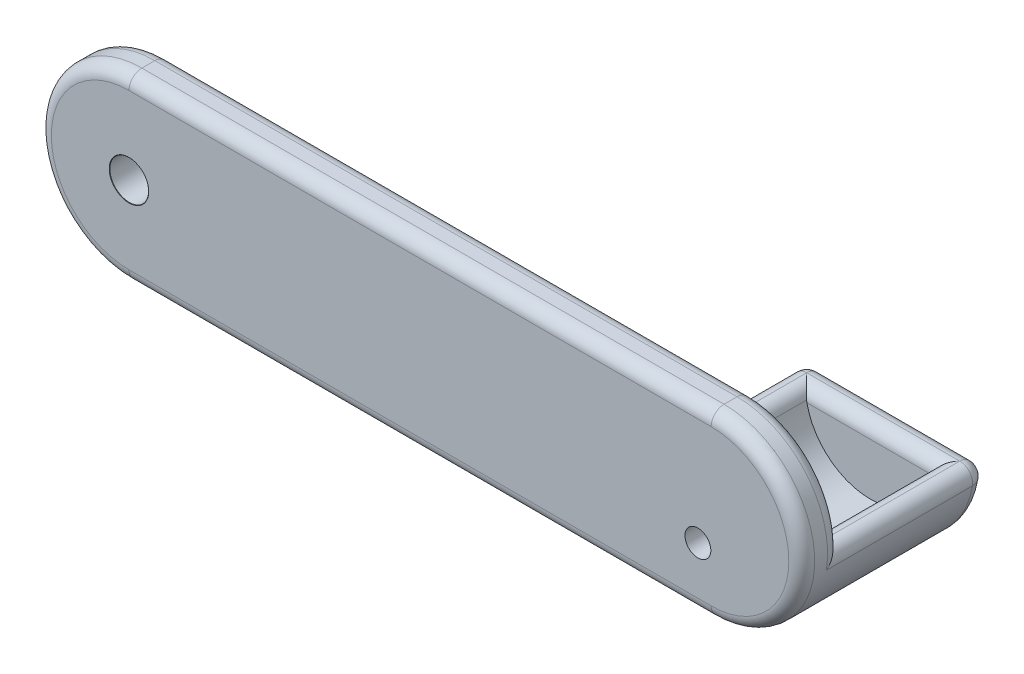
ISO-10303-21;
HEADER;
FILE_DESCRIPTION(('STEP AP214'),'2;1');
FILE_NAME('part.step','',(''),(''),'','','');
FILE_SCHEMA(('AUTOMOTIVE_DESIGN { 1 0 10303 214 1 1 1 1 }'));
ENDSEC;
DATA;
#1=APPLICATION_CONTEXT('core data for automotive mechanical design processes');
#2=APPLICATION_PROTOCOL_DEFINITION('international standard','automotive_design',2000,#1);
#3=PRODUCT_CONTEXT('',#1,'mechanical');
#4=PRODUCT('Part','Part','',(#3));
#5=PRODUCT_RELATED_PRODUCT_CATEGORY('part','',(#4));
#6=PRODUCT_DEFINITION_FORMATION('','',#4);
#7=PRODUCT_DEFINITION_CONTEXT('part definition',#1,'design');
#8=PRODUCT_DEFINITION('design','',#6,#7);
#9=PRODUCT_DEFINITION_SHAPE('','',#8);
#10=(LENGTH_UNIT() NAMED_UNIT(*) SI_UNIT(.MILLI.,.METRE.));
#11=(NAMED_UNIT(*) PLANE_ANGLE_UNIT() SI_UNIT($,.RADIAN.));
#12=(NAMED_UNIT(*) SI_UNIT($,.STERADIAN.) SOLID_ANGLE_UNIT());
#13=UNCERTAINTY_MEASURE_WITH_UNIT(LENGTH_MEASURE(1.E-05),#10,'distance_accuracy_value','');
#14=(GEOMETRIC_REPRESENTATION_CONTEXT(3) GLOBAL_UNCERTAINTY_ASSIGNED_CONTEXT((#13)) GLOBAL_UNIT_ASSIGNED_CONTEXT((#10,
#11,#12)) REPRESENTATION_CONTEXT('',''));
#15=CARTESIAN_POINT('',(0.,0.,0.));
#16=DIRECTION('',(0.,0.,1.));
#17=DIRECTION('',(1.,0.,0.));
#18=AXIS2_PLACEMENT_3D('',#15,#16,#17);
#19=CARTESIAN_POINT('',(0.,0.,3.));
#20=DIRECTION('',(0.,0.,-1.));
#21=DIRECTION('',(-1.,0.,0.));
#22=AXIS2_PLACEMENT_3D('',#19,#20,#21);
#23=CYLINDRICAL_SURFACE('',#22,7.);
#24=DIRECTION('',(0.,0.,-1.));
#25=VECTOR('',#24,1.);
#26=CARTESIAN_POINT('',(0.,-7.,3.));
#27=LINE('',#26,#25);
#28=CARTESIAN_POINT('',(0.,-7.,2.));
#29=VERTEX_POINT('',#28);
#30=CARTESIAN_POINT('',(0.,-7.,1.));
#31=VERTEX_POINT('',#30);
#32=EDGE_CURVE('E501',#29,#31,#27,.T.);
#33=ORIENTED_EDGE('',*,*,#32,.F.);
#34=CARTESIAN_POINT('',(0.,0.,2.));
#35=DIRECTION('',(0.,0.,1.));
#36=DIRECTION('',(1.,0.,0.));
#37=AXIS2_PLACEMENT_3D('',#34,#35,#36);
#38=CIRCLE('',#37,7.);
#39=CARTESIAN_POINT('',(0.,7.,2.));
#40=VERTEX_POINT('',#39);
#41=EDGE_CURVE('E427',#29,#40,#38,.F.);
#42=ORIENTED_EDGE('',*,*,#41,.T.);
#43=DIRECTION('',(0.,0.,-1.));
#44=VECTOR('',#43,1.);
#45=CARTESIAN_POINT('',(0.,7.,3.));
#46=LINE('',#45,#44);
#47=CARTESIAN_POINT('',(0.,7.,1.));
#48=VERTEX_POINT('',#47);
#49=EDGE_CURVE('E533',#40,#48,#46,.T.);
#50=ORIENTED_EDGE('',*,*,#49,.T.);
#51=CARTESIAN_POINT('',(0.,0.,1.));
#52=DIRECTION('',(0.,0.,1.));
#53=DIRECTION('',(1.,0.,0.));
#54=AXIS2_PLACEMENT_3D('',#51,#52,#53);
#55=CIRCLE('',#54,7.);
#56=EDGE_CURVE('E529',#48,#31,#55,.T.);
#57=ORIENTED_EDGE('',*,*,#56,.T.);
#58=EDGE_LOOP('',(#33,#42,#50,#57));
#59=FACE_BOUND('',#58,.T.);
#60=ADVANCED_FACE('F39',(#59),#23,.T.);
#61=CARTESIAN_POINT('',(0.,-7.,3.));
#62=DIRECTION('',(0.,1.,0.));
#63=DIRECTION('',(0.,0.,1.));
#64=AXIS2_PLACEMENT_3D('',#61,#62,#63);
#65=PLANE('',#64);
#66=DIRECTION('',(0.,0.,-1.));
#67=VECTOR('',#66,1.);
#68=CARTESIAN_POINT('',(45.,-7.,3.));
#69=LINE('',#68,#67);
#70=CARTESIAN_POINT('',(45.,-7.,2.));
#71=VERTEX_POINT('',#70);
#72=CARTESIAN_POINT('',(45.,-7.,1.));
#73=VERTEX_POINT('',#72);
#74=EDGE_CURVE('E508',#71,#73,#69,.T.);
#75=ORIENTED_EDGE('',*,*,#74,.F.);
#76=DIRECTION('',(1.,0.,0.));
#77=VECTOR('',#76,1.);
#78=CARTESIAN_POINT('',(0.,-7.,2.));
#79=LINE('',#78,#77);
#80=EDGE_CURVE('E526',#71,#29,#79,.F.);
#81=ORIENTED_EDGE('',*,*,#80,.T.);
#82=ORIENTED_EDGE('',*,*,#32,.T.);
#83=DIRECTION('',(1.,0.,0.));
#84=VECTOR('',#83,1.);
#85=CARTESIAN_POINT('',(0.,-7.,1.));
#86=LINE('',#85,#84);
#87=EDGE_CURVE('E522',#31,#73,#86,.T.);
#88=ORIENTED_EDGE('',*,*,#87,.T.);
#89=EDGE_LOOP('',(#75,#81,#82,#88));
#90=FACE_BOUND('',#89,.T.);
#91=ADVANCED_FACE('F372',(#90),#65,.F.);
#92=CARTESIAN_POINT('',(45.,0.,3.));
#93=DIRECTION('',(0.,0.,-1.));
#94=DIRECTION('',(-1.,0.,0.));
#95=AXIS2_PLACEMENT_3D('',#92,#93,#94);
#96=CYLINDRICAL_SURFACE('',#95,7.);
#97=DIRECTION('',(0.,0.,-1.));
#98=VECTOR('',#97,1.);
#99=CARTESIAN_POINT('',(45.,7.,3.));
#100=LINE('',#99,#98);
#101=CARTESIAN_POINT('',(45.,7.,2.));
#102=VERTEX_POINT('',#101);
#103=CARTESIAN_POINT('',(45.,7.,1.));
#104=VERTEX_POINT('',#103);
#105=EDGE_CURVE('E537',#102,#104,#100,.T.);
#106=ORIENTED_EDGE('',*,*,#105,.F.);
#107=CARTESIAN_POINT('',(45.,0.,2.));
#108=DIRECTION('',(0.,0.,1.));
#109=DIRECTION('',(1.,0.,0.));
#110=AXIS2_PLACEMENT_3D('',#107,#108,#109);
#111=CIRCLE('',#110,7.);
#112=EDGE_CURVE('E469',#102,#71,#111,.F.);
#113=ORIENTED_EDGE('',*,*,#112,.T.);
#114=ORIENTED_EDGE('',*,*,#74,.T.);
#115=CARTESIAN_POINT('',(41.394448724536,-6.,0.));
#116=CARTESIAN_POINT('',(41.4450582268438,-6.03041382753642,7.08769697743042E-06));
#117=CARTESIAN_POINT('',(41.496037033125,-6.06017529147223,0.00138651836895668));
#118=CARTESIAN_POINT('',(41.5986147008607,-6.11833715170324,0.00659608572355327));
#119=CARTESIAN_POINT('',(41.6502132829137,-6.14673813449379,0.0104251559731933));
#120=CARTESIAN_POINT('',(41.8055802187509,-6.22972265473013,0.0251248258331152));
#121=CARTESIAN_POINT('',(41.9101619313692,-6.28223313790196,0.039210738007179));
#122=CARTESIAN_POINT('',(42.1203271140369,-6.38129477477753,0.074064378667023));
#123=CARTESIAN_POINT('',(42.225903170781,-6.42787385145519,0.0947990492975347));
#124=CARTESIAN_POINT('',(42.4382615831537,-6.51542025173984,0.141626106099852));
#125=CARTESIAN_POINT('',(42.5450448307451,-6.55638308630496,0.167722736920281));
#126=CARTESIAN_POINT('',(42.8433780021751,-6.66259073906168,0.246247130070275));
#127=CARTESIAN_POINT('',(43.035901662057,-6.72176788527623,0.303304781123062));
#128=CARTESIAN_POINT('',(43.4225710412745,-6.82288362390491,0.42624186896687));
#129=CARTESIAN_POINT('',(43.6167177322626,-6.86481100323072,0.492127007236582));
#130=CARTESIAN_POINT('',(44.2010708063447,-6.96548017899727,0.698011486307675));
#131=CARTESIAN_POINT('',(44.5931882114788,-6.99910832303838,0.846239297791334));
#132=CARTESIAN_POINT('',(44.9895651844608,-6.99999416059354,0.996056036911788));
#133=CARTESIAN_POINT('',(44.9947826816277,-6.99999999336149,0.998028066018506));
#134=CARTESIAN_POINT('',(45.,-7.,1.));
#135=B_SPLINE_CURVE_WITH_KNOTS('',3,(#115,#116,#117,#118,#119,#120,#121,#122,#123,#124,#125,
#126,#127,#128,#129,#130,#131,#132,#133,#134),.UNSPECIFIED.,.F.,.F.,(4,2,2,2,2,2,2,2,2,4),(0.,
0.177083512310358,0.354089984998802,0.707258810861283,1.05869820978894,1.41041689543041,
2.03723640077628,2.66446272434067,3.91892182880158,3.93565503848337),.UNSPECIFIED.);
#136=CARTESIAN_POINT('',(41.394448724536,-6.,0.));
#137=VERTEX_POINT('',#136);
#138=EDGE_CURVE('E375',#73,#137,#135,.F.);
#139=ORIENTED_EDGE('',*,*,#138,.T.);
#140=CARTESIAN_POINT('',(45.,0.,0.));
#141=DIRECTION('',(0.,0.,1.));
#142=DIRECTION('',(1.,0.,0.));
#143=AXIS2_PLACEMENT_3D('',#140,#141,#142);
#144=CIRCLE('',#143,7.);
#145=CARTESIAN_POINT('',(38.0979069197171,-1.16666666666667,0.));
#146=VERTEX_POINT('',#145);
#147=EDGE_CURVE('E500',#146,#137,#144,.T.);
#148=ORIENTED_EDGE('',*,*,#147,.F.);
#149=DIRECTION('',(0.,0.,-1.));
#150=VECTOR('',#149,1.);
#151=CARTESIAN_POINT('',(38.0979069197171,-1.16666666666667,3.));
#152=LINE('',#151,#150);
#153=CARTESIAN_POINT('',(38.0979069197171,-1.16666666666667,-10.3));
#154=VERTEX_POINT('',#153);
#155=EDGE_CURVE('E466',#146,#154,#152,.T.);
#156=ORIENTED_EDGE('',*,*,#155,.T.);
#157=CARTESIAN_POINT('',(45.,0.,-10.3));
#158=DIRECTION('',(0.,0.,-1.));
#159=DIRECTION('',(-1.,0.,0.));
#160=AXIS2_PLACEMENT_3D('',#157,#158,#159);
#161=CIRCLE('',#160,7.);
#162=CARTESIAN_POINT('',(51.9020930802829,-1.16666666666667,-10.3));
#163=VERTEX_POINT('',#162);
#164=EDGE_CURVE('E460',#154,#163,#161,.F.);
#165=ORIENTED_EDGE('',*,*,#164,.T.);
#166=DIRECTION('',(0.,0.,-1.));
#167=VECTOR('',#166,1.);
#168=CARTESIAN_POINT('',(51.9020930802829,-1.16666666666667,3.));
#169=LINE('',#168,#167);
#170=CARTESIAN_POINT('',(51.9020930802829,-1.16666666666667,1.));
#171=VERTEX_POINT('',#170);
#172=EDGE_CURVE('E457',#163,#171,#169,.F.);
#173=ORIENTED_EDGE('',*,*,#172,.T.);
#174=CARTESIAN_POINT('',(45.,0.,1.));
#175=DIRECTION('',(0.,0.,1.));
#176=DIRECTION('',(1.,0.,0.));
#177=AXIS2_PLACEMENT_3D('',#174,#175,#176);
#178=CIRCLE('',#177,7.);
#179=EDGE_CURVE('E463',#171,#104,#178,.T.);
#180=ORIENTED_EDGE('',*,*,#179,.T.);
#181=EDGE_LOOP('',(#106,#113,#114,#139,#148,#156,#165,#173,#180));
#182=FACE_BOUND('',#181,.T.);
#183=ADVANCED_FACE('F367',(#182),#96,.T.);
#184=CARTESIAN_POINT('',(0.,7.,3.));
#185=DIRECTION('',(0.,-1.,0.));
#186=DIRECTION('',(0.,0.,-1.));
#187=AXIS2_PLACEMENT_3D('',#184,#185,#186);
#188=PLANE('',#187);
#189=ORIENTED_EDGE('',*,*,#49,.F.);
#190=DIRECTION('',(-1.,0.,0.));
#191=VECTOR('',#190,1.);
#192=CARTESIAN_POINT('',(45.,7.,2.));
#193=LINE('',#192,#191);
#194=EDGE_CURVE('E434',#40,#102,#193,.F.);
#195=ORIENTED_EDGE('',*,*,#194,.T.);
#196=ORIENTED_EDGE('',*,*,#105,.T.);
#197=DIRECTION('',(-1.,0.,0.));
#198=VECTOR('',#197,1.);
#199=CARTESIAN_POINT('',(0.,7.,1.));
#200=LINE('',#199,#198);
#201=EDGE_CURVE('E440',#104,#48,#200,.T.);
#202=ORIENTED_EDGE('',*,*,#201,.T.);
#203=EDGE_LOOP('',(#189,#195,#196,#202));
#204=FACE_BOUND('',#203,.T.);
#205=ADVANCED_FACE('F360',(#204),#188,.F.);
#206=CARTESIAN_POINT('',(0.,0.,3.));
#207=DIRECTION('',(0.,0.,1.));
#208=DIRECTION('',(1.,0.,0.));
#209=AXIS2_PLACEMENT_3D('',#206,#207,#208);
#210=PLANE('',#209);
#211=CARTESIAN_POINT('',(43.9748477834291,-2.3,3.));
#212=DIRECTION('',(0.,0.,1.));
#213=DIRECTION('',(1.,0.,0.));
#214=AXIS2_PLACEMENT_3D('',#211,#212,#213);
#215=CIRCLE('',#214,0.999999999999994);
#216=CARTESIAN_POINT('',(44.9748477834291,-2.3,3.));
#217=VERTEX_POINT('',#216);
#218=EDGE_CURVE('E272',#217,#217,#215,.T.);
#219=ORIENTED_EDGE('',*,*,#218,.F.);
#220=EDGE_LOOP('',(#219));
#221=FACE_BOUND('',#220,.T.);
#222=CARTESIAN_POINT('',(0.,0.,3.));
#223=DIRECTION('',(0.,0.,1.));
#224=DIRECTION('',(1.,0.,0.));
#225=AXIS2_PLACEMENT_3D('',#222,#223,#224);
#226=CIRCLE('',#225,6.);
#227=CARTESIAN_POINT('',(0.,6.,3.));
#228=VERTEX_POINT('',#227);
#229=CARTESIAN_POINT('',(0.,-6.,3.));
#230=VERTEX_POINT('',#229);
#231=EDGE_CURVE('E429',#228,#230,#226,.T.);
#232=ORIENTED_EDGE('',*,*,#231,.T.);
#233=DIRECTION('',(1.,0.,0.));
#234=VECTOR('',#233,1.);
#235=CARTESIAN_POINT('',(45.,-6.,3.));
#236=LINE('',#235,#234);
#237=CARTESIAN_POINT('',(45.,-6.,3.));
#238=VERTEX_POINT('',#237);
#239=EDGE_CURVE('E518',#230,#238,#236,.T.);
#240=ORIENTED_EDGE('',*,*,#239,.T.);
#241=CARTESIAN_POINT('',(45.,0.,3.));
#242=DIRECTION('',(0.,0.,1.));
#243=DIRECTION('',(1.,0.,0.));
#244=AXIS2_PLACEMENT_3D('',#241,#242,#243);
#245=CIRCLE('',#244,6.);
#246=CARTESIAN_POINT('',(45.,6.,3.));
#247=VERTEX_POINT('',#246);
#248=EDGE_CURVE('E505',#238,#247,#245,.T.);
#249=ORIENTED_EDGE('',*,*,#248,.T.);
#250=DIRECTION('',(-1.,0.,0.));
#251=VECTOR('',#250,1.);
#252=CARTESIAN_POINT('',(0.,6.,3.));
#253=LINE('',#252,#251);
#254=EDGE_CURVE('E433',#247,#228,#253,.T.);
#255=ORIENTED_EDGE('',*,*,#254,.T.);
#256=EDGE_LOOP('',(#232,#240,#249,#255));
#257=FACE_BOUND('',#256,.T.);
#258=CARTESIAN_POINT('',(0.,0.,3.));
#259=DIRECTION('',(0.,0.,1.));
#260=DIRECTION('',(1.,0.,0.));
#261=AXIS2_PLACEMENT_3D('',#258,#259,#260);
#262=CIRCLE('',#261,1.525);
#263=CARTESIAN_POINT('',(1.525,0.,3.));
#264=VERTEX_POINT('',#263);
#265=EDGE_CURVE('E556',#264,#264,#262,.T.);
#266=ORIENTED_EDGE('',*,*,#265,.F.);
#267=EDGE_LOOP('',(#266));
#268=FACE_BOUND('',#267,.T.);
#269=ADVANCED_FACE('F357',(#221,#257,#268),#210,.T.);
#270=CARTESIAN_POINT('',(0.,0.,0.));
#271=DIRECTION('',(0.,0.,1.));
#272=DIRECTION('',(1.,0.,0.));
#273=AXIS2_PLACEMENT_3D('',#270,#271,#272);
#274=PLANE('',#273);
#275=CARTESIAN_POINT('',(0.,0.,0.));
#276=DIRECTION('',(0.,0.,1.));
#277=DIRECTION('',(1.,0.,0.));
#278=AXIS2_PLACEMENT_3D('',#275,#276,#277);
#279=CIRCLE('',#278,1.5);
#280=CARTESIAN_POINT('',(1.5,0.,0.));
#281=VERTEX_POINT('',#280);
#282=EDGE_CURVE('E538',#281,#281,#279,.T.);
#283=ORIENTED_EDGE('',*,*,#282,.T.);
#284=EDGE_LOOP('',(#283));
#285=FACE_BOUND('',#284,.T.);
#286=ORIENTED_EDGE('',*,*,#147,.T.);
#287=DIRECTION('',(1.,0.,0.));
#288=VECTOR('',#287,1.);
#289=CARTESIAN_POINT('',(0.,-6.,0.));
#290=LINE('',#289,#288);
#291=CARTESIAN_POINT('',(0.,-6.,0.));
#292=VERTEX_POINT('',#291);
#293=EDGE_CURVE('E454',#137,#292,#290,.F.);
#294=ORIENTED_EDGE('',*,*,#293,.T.);
#295=CARTESIAN_POINT('',(0.,0.,0.));
#296=DIRECTION('',(0.,0.,1.));
#297=DIRECTION('',(1.,0.,0.));
#298=AXIS2_PLACEMENT_3D('',#295,#296,#297);
#299=CIRCLE('',#298,6.);
#300=CARTESIAN_POINT('',(0.,6.,0.));
#301=VERTEX_POINT('',#300);
#302=EDGE_CURVE('E451',#292,#301,#299,.F.);
#303=ORIENTED_EDGE('',*,*,#302,.T.);
#304=DIRECTION('',(-1.,0.,0.));
#305=VECTOR('',#304,1.);
#306=CARTESIAN_POINT('',(0.,6.,0.));
#307=LINE('',#306,#305);
#308=CARTESIAN_POINT('',(45.,6.,0.));
#309=VERTEX_POINT('',#308);
#310=EDGE_CURVE('E444',#301,#309,#307,.F.);
#311=ORIENTED_EDGE('',*,*,#310,.T.);
#312=CARTESIAN_POINT('',(45.,0.,0.));
#313=DIRECTION('',(0.,0.,1.));
#314=DIRECTION('',(1.,0.,0.));
#315=AXIS2_PLACEMENT_3D('',#312,#313,#314);
#316=CIRCLE('',#315,6.);
#317=CARTESIAN_POINT('',(50.9999989630996,-0.00352743578701569,0.));
#318=VERTEX_POINT('',#317);
#319=EDGE_CURVE('E185',#309,#318,#316,.F.);
#320=ORIENTED_EDGE('',*,*,#319,.T.);
#321=CARTESIAN_POINT('',(50.9160797830996,-0.999999999999999,0.));
#322=DIRECTION('',(0.,0.,1.));
#323=DIRECTION('',(1.,0.,0.));
#324=AXIS2_PLACEMENT_3D('',#321,#322,#323);
#325=CIRCLE('',#324,1.);
#326=CARTESIAN_POINT('',(50.9160797830996,0.,0.));
#327=VERTEX_POINT('',#326);
#328=EDGE_CURVE('E11',#318,#327,#325,.T.);
#329=ORIENTED_EDGE('',*,*,#328,.T.);
#330=CARTESIAN_POINT('',(50.9160797830996,-0.999999999999999,0.));
#331=DIRECTION('',(0.,0.,1.));
#332=DIRECTION('',(1.,0.,0.));
#333=AXIS2_PLACEMENT_3D('',#330,#331,#332);
#334=CIRCLE('',#333,1.);
#335=CARTESIAN_POINT('',(49.9300664859163,-0.833333333333333,0.));
#336=VERTEX_POINT('',#335);
#337=EDGE_CURVE('E183',#327,#336,#334,.T.);
#338=ORIENTED_EDGE('',*,*,#337,.T.);
#339=CARTESIAN_POINT('',(45.,0.,0.));
#340=DIRECTION('',(0.,0.,1.));
#341=DIRECTION('',(1.,0.,0.));
#342=AXIS2_PLACEMENT_3D('',#339,#340,#341);
#343=CIRCLE('',#342,5.);
#344=CARTESIAN_POINT('',(50.,0.,0.));
#345=VERTEX_POINT('',#344);
#346=EDGE_CURVE('E59',#345,#336,#343,.F.);
#347=ORIENTED_EDGE('',*,*,#346,.F.);
#348=DIRECTION('',(-1.,0.,0.));
#349=VECTOR('',#348,1.);
#350=CARTESIAN_POINT('',(0.,0.,0.));
#351=LINE('',#350,#349);
#352=CARTESIAN_POINT('',(40.,0.,0.));
#353=VERTEX_POINT('',#352);
#354=EDGE_CURVE('E498',#345,#353,#351,.T.);
#355=ORIENTED_EDGE('',*,*,#354,.T.);
#356=CARTESIAN_POINT('',(45.,0.,0.));
#357=DIRECTION('',(0.,0.,1.));
#358=DIRECTION('',(1.,0.,0.));
#359=AXIS2_PLACEMENT_3D('',#356,#357,#358);
#360=CIRCLE('',#359,5.);
#361=CARTESIAN_POINT('',(40.0699335140837,-0.833333333333333,0.));
#362=VERTEX_POINT('',#361);
#363=EDGE_CURVE('E482',#362,#353,#360,.F.);
#364=ORIENTED_EDGE('',*,*,#363,.F.);
#365=CARTESIAN_POINT('',(39.0839202169004,-0.999999999999999,0.));
#366=DIRECTION('',(0.,0.,1.));
#367=DIRECTION('',(1.,0.,0.));
#368=AXIS2_PLACEMENT_3D('',#365,#366,#367);
#369=CIRCLE('',#368,1.);
#370=CARTESIAN_POINT('',(39.0839202169004,0.,0.));
#371=VERTEX_POINT('',#370);
#372=EDGE_CURVE('E199',#362,#371,#369,.T.);
#373=ORIENTED_EDGE('',*,*,#372,.T.);
#374=CARTESIAN_POINT('',(39.0839202169004,-0.999999999999999,0.));
#375=DIRECTION('',(0.,0.,1.));
#376=DIRECTION('',(1.,0.,0.));
#377=AXIS2_PLACEMENT_3D('',#374,#375,#376);
#378=CIRCLE('',#377,1.);
#379=EDGE_CURVE('E50',#371,#146,#378,.T.);
#380=ORIENTED_EDGE('',*,*,#379,.T.);
#381=EDGE_LOOP('',(#286,#294,#303,#311,#320,#329,#338,#347,#355,#364,#373,#380));
#382=FACE_BOUND('',#381,.T.);
#383=ADVANCED_FACE('F182',(#285,#382),#274,.F.);
#384=CARTESIAN_POINT('',(0.,0.,3.));
#385=DIRECTION('',(0.,0.,1.));
#386=DIRECTION('',(1.,0.,0.));
#387=AXIS2_PLACEMENT_3D('',#384,#385,#386);
#388=CYLINDRICAL_SURFACE('',#387,1.5);
#389=ORIENTED_EDGE('',*,*,#282,.F.);
#390=EDGE_LOOP('',(#389));
#391=FACE_BOUND('',#390,.T.);
#392=CARTESIAN_POINT('',(0.,0.,2.97902250922057));
#393=DIRECTION('',(0.,0.,1.));
#394=DIRECTION('',(1.,0.,0.));
#395=AXIS2_PLACEMENT_3D('',#392,#393,#394);
#396=CIRCLE('',#395,1.5);
#397=CARTESIAN_POINT('',(1.5,0.,2.97902250922057));
#398=VERTEX_POINT('',#397);
#399=EDGE_CURVE('E544',#398,#398,#396,.T.);
#400=ORIENTED_EDGE('',*,*,#399,.T.);
#401=EDGE_LOOP('',(#400));
#402=FACE_BOUND('',#401,.T.);
#403=ADVANCED_FACE('F352',(#391,#402),#388,.F.);
#404=CARTESIAN_POINT('',(0.,0.,3.));
#405=DIRECTION('',(0.,0.,1.));
#406=DIRECTION('',(1.,0.,0.));
#407=AXIS2_PLACEMENT_3D('',#404,#405,#406);
#408=CONICAL_SURFACE('',#407,1.525,0.872664625997208);
#409=ORIENTED_EDGE('',*,*,#399,.F.);
#410=EDGE_LOOP('',(#409));
#411=FACE_BOUND('',#410,.T.);
#412=ORIENTED_EDGE('',*,*,#265,.T.);
#413=EDGE_LOOP('',(#412));
#414=FACE_BOUND('',#413,.T.);
#415=ADVANCED_FACE('F348',(#411,#414),#408,.F.);
#416=CARTESIAN_POINT('',(45.,0.,-11.3));
#417=DIRECTION('',(0.,0.,-1.));
#418=DIRECTION('',(-1.,0.,0.));
#419=AXIS2_PLACEMENT_3D('',#416,#417,#418);
#420=PLANE('',#419);
#421=DIRECTION('',(-1.,0.,0.));
#422=VECTOR('',#421,1.);
#423=CARTESIAN_POINT('',(45.,-1.,-11.3));
#424=LINE('',#423,#422);
#425=CARTESIAN_POINT('',(39.0839202169004,-1.,-11.3));
#426=VERTEX_POINT('',#425);
#427=CARTESIAN_POINT('',(50.9160797830996,-1.,-11.3));
#428=VERTEX_POINT('',#427);
#429=EDGE_CURVE('E472',#426,#428,#424,.F.);
#430=ORIENTED_EDGE('',*,*,#429,.T.);
#431=CARTESIAN_POINT('',(45.,0.,-11.3));
#432=DIRECTION('',(0.,0.,-1.));
#433=DIRECTION('',(-1.,0.,0.));
#434=AXIS2_PLACEMENT_3D('',#431,#432,#433);
#435=CIRCLE('',#434,6.);
#436=EDGE_CURVE('E475',#428,#426,#435,.T.);
#437=ORIENTED_EDGE('',*,*,#436,.T.);
#438=EDGE_LOOP('',(#430,#437));
#439=FACE_BOUND('',#438,.T.);
#440=ADVANCED_FACE('F345',(#439),#420,.T.);
#441=CARTESIAN_POINT('',(38.,0.,-11.3));
#442=DIRECTION('',(0.,1.,0.));
#443=DIRECTION('',(0.,0.,1.));
#444=AXIS2_PLACEMENT_3D('',#441,#442,#443);
#445=PLANE('',#444);
#446=DIRECTION('',(0.,0.,-1.));
#447=VECTOR('',#446,1.);
#448=CARTESIAN_POINT('',(50.,0.,-9.3));
#449=LINE('',#448,#447);
#450=CARTESIAN_POINT('',(50.,0.,1.));
#451=VERTEX_POINT('',#450);
#452=EDGE_CURVE('E86',#345,#451,#449,.F.);
#453=ORIENTED_EDGE('',*,*,#452,.T.);
#454=DIRECTION('',(-1.,0.,0.));
#455=VECTOR('',#454,1.);
#456=CARTESIAN_POINT('',(0.,0.,1.));
#457=LINE('',#456,#455);
#458=CARTESIAN_POINT('',(40.,0.,1.));
#459=VERTEX_POINT('',#458);
#460=EDGE_CURVE('E559',#451,#459,#457,.T.);
#461=ORIENTED_EDGE('',*,*,#460,.T.);
#462=DIRECTION('',(0.,0.,-1.));
#463=VECTOR('',#462,1.);
#464=CARTESIAN_POINT('',(40.,0.,-9.3));
#465=LINE('',#464,#463);
#466=EDGE_CURVE('E495',#353,#459,#465,.F.);
#467=ORIENTED_EDGE('',*,*,#466,.F.);
#468=ORIENTED_EDGE('',*,*,#354,.F.);
#469=EDGE_LOOP('',(#453,#461,#467,#468));
#470=FACE_BOUND('',#469,.T.);
#471=ADVANCED_FACE('F333',(#470),#445,.F.);
#472=CARTESIAN_POINT('',(45.,0.,3.));
#473=DIRECTION('',(0.,0.,-1.));
#474=DIRECTION('',(-1.,0.,0.));
#475=AXIS2_PLACEMENT_3D('',#472,#473,#474);
#476=CYLINDRICAL_SURFACE('',#475,5.);
#477=ORIENTED_EDGE('',*,*,#452,.F.);
#478=ORIENTED_EDGE('',*,*,#346,.T.);
#479=DIRECTION('',(0.,0.,-1.));
#480=VECTOR('',#479,1.);
#481=CARTESIAN_POINT('',(49.9300664859163,-0.833333333333333,3.));
#482=LINE('',#481,#480);
#483=CARTESIAN_POINT('',(49.9300664859163,-0.833333333333333,-9.31398670281663));
#484=VERTEX_POINT('',#483);
#485=EDGE_CURVE('E197',#336,#484,#482,.T.);
#486=ORIENTED_EDGE('',*,*,#485,.T.);
#487=CARTESIAN_POINT('',(49.9300664859163,-0.833333333333333,-9.31398670281663));
#488=CARTESIAN_POINT('',(49.9253916142134,-0.861009601778235,-9.30932069546009));
#489=CARTESIAN_POINT('',(49.9204635949994,-0.888736624889429,-9.30582213321377));
#490=CARTESIAN_POINT('',(49.9101012615495,-0.944292180444995,-9.3011598989415));
#491=CARTESIAN_POINT('',(49.9046669473134,-0.97212071288937,-9.29999622691561));
#492=CARTESIAN_POINT('',(49.8989794855664,-1.00000000000004,-9.29999999999999));
#493=B_SPLINE_CURVE_WITH_KNOTS('',3,(#487,#488,#489,#490,#491,#492),.UNSPECIFIED.,.F.,.F.,(4,2,
4),(0.,0.0851341182837871,0.170268236569399),.UNSPECIFIED.);
#494=CARTESIAN_POINT('',(49.8989794855664,-1.,-9.3));
#495=VERTEX_POINT('',#494);
#496=EDGE_CURVE('E200',#484,#495,#493,.T.);
#497=ORIENTED_EDGE('',*,*,#496,.T.);
#498=CARTESIAN_POINT('',(45.,0.,-9.3));
#499=DIRECTION('',(0.,0.,-1.));
#500=DIRECTION('',(-1.,0.,0.));
#501=AXIS2_PLACEMENT_3D('',#498,#499,#500);
#502=CIRCLE('',#501,5.);
#503=CARTESIAN_POINT('',(40.1010205144336,-1.,-9.3));
#504=VERTEX_POINT('',#503);
#505=EDGE_CURVE('E266',#504,#495,#502,.F.);
#506=ORIENTED_EDGE('',*,*,#505,.F.);
#507=CARTESIAN_POINT('',(40.1010205144336,-1.,-9.3));
#508=CARTESIAN_POINT('',(40.0953330526866,-0.972120712889341,-9.29999622691564));
#509=CARTESIAN_POINT('',(40.0898987384505,-0.944292180444974,-9.30115989894153));
#510=CARTESIAN_POINT('',(40.0795364050006,-0.888736624889421,-9.30582213321374));
#511=CARTESIAN_POINT('',(40.0746083857866,-0.861009601778232,-9.30932069546002));
#512=CARTESIAN_POINT('',(40.0699335140837,-0.833333333333332,-9.31398670281649));
#513=B_SPLINE_CURVE_WITH_KNOTS('',3,(#507,#508,#509,#510,#511,#512),.UNSPECIFIED.,.F.,.F.,(4,2,
4),(0.,0.0851341182855874,0.170268236569343),.UNSPECIFIED.);
#514=CARTESIAN_POINT('',(40.0699335140837,-0.833333333333333,-9.31398670281663));
#515=VERTEX_POINT('',#514);
#516=EDGE_CURVE('E313',#504,#515,#513,.T.);
#517=ORIENTED_EDGE('',*,*,#516,.T.);
#518=DIRECTION('',(0.,0.,-1.));
#519=VECTOR('',#518,1.);
#520=CARTESIAN_POINT('',(40.0699335140837,-0.833333333333333,3.));
#521=LINE('',#520,#519);
#522=EDGE_CURVE('E485',#515,#362,#521,.F.);
#523=ORIENTED_EDGE('',*,*,#522,.T.);
#524=ORIENTED_EDGE('',*,*,#363,.T.);
#525=ORIENTED_EDGE('',*,*,#466,.T.);
#526=CARTESIAN_POINT('',(45.,0.,1.));
#527=DIRECTION('',(0.,0.,1.));
#528=DIRECTION('',(1.,0.,0.));
#529=AXIS2_PLACEMENT_3D('',#526,#527,#528);
#530=CIRCLE('',#529,5.);
#531=EDGE_CURVE('E493',#459,#451,#530,.T.);
#532=ORIENTED_EDGE('',*,*,#531,.T.);
#533=EDGE_LOOP('',(#477,#478,#486,#497,#506,#517,#523,#524,#525,#532));
#534=FACE_BOUND('',#533,.T.);
#535=ADVANCED_FACE('F327',(#534),#476,.F.);
#536=CARTESIAN_POINT('',(0.,0.,1.));
#537=DIRECTION('',(0.,0.,1.));
#538=DIRECTION('',(1.,0.,0.));
#539=AXIS2_PLACEMENT_3D('',#536,#537,#538);
#540=PLANE('',#539);
#541=CARTESIAN_POINT('',(43.9748477834291,-2.3,0.999999999999998));
#542=DIRECTION('',(0.,0.,-1.));
#543=DIRECTION('',(-1.,0.,0.));
#544=AXIS2_PLACEMENT_3D('',#541,#542,#543);
#545=CIRCLE('',#544,1.025);
#546=CARTESIAN_POINT('',(42.9498477834291,-2.3,0.999999999999998));
#547=VERTEX_POINT('',#546);
#548=EDGE_CURVE('E580',#547,#547,#545,.T.);
#549=ORIENTED_EDGE('',*,*,#548,.F.);
#550=EDGE_LOOP('',(#549));
#551=FACE_BOUND('',#550,.T.);
#552=ORIENTED_EDGE('',*,*,#460,.F.);
#553=ORIENTED_EDGE('',*,*,#531,.F.);
#554=EDGE_LOOP('',(#552,#553));
#555=FACE_BOUND('',#554,.T.);
#556=ADVANCED_FACE('F332',(#551,#555),#540,.F.);
#557=CARTESIAN_POINT('',(45.,0.,-9.3));
#558=DIRECTION('',(0.,0.,-1.));
#559=DIRECTION('',(-1.,0.,0.));
#560=AXIS2_PLACEMENT_3D('',#557,#558,#559);
#561=PLANE('',#560);
#562=ORIENTED_EDGE('',*,*,#505,.T.);
#563=DIRECTION('',(-1.,0.,0.));
#564=VECTOR('',#563,1.);
#565=CARTESIAN_POINT('',(40.,-1.,-9.3));
#566=LINE('',#565,#564);
#567=EDGE_CURVE('E479',#495,#504,#566,.T.);
#568=ORIENTED_EDGE('',*,*,#567,.T.);
#569=EDGE_LOOP('',(#562,#568));
#570=FACE_BOUND('',#569,.T.);
#571=ADVANCED_FACE('F339',(#570),#561,.F.);
#572=CARTESIAN_POINT('',(0.,6.,2.));
#573=DIRECTION('',(1.,0.,0.));
#574=DIRECTION('',(0.,0.,-1.));
#575=AXIS2_PLACEMENT_3D('',#572,#573,#574);
#576=CYLINDRICAL_SURFACE('',#575,1.);
#577=CARTESIAN_POINT('',(45.,6.,2.));
#578=DIRECTION('',(1.,0.,0.));
#579=DIRECTION('',(0.,0.,-1.));
#580=AXIS2_PLACEMENT_3D('',#577,#578,#579);
#581=CIRCLE('',#580,1.);
#582=EDGE_CURVE('E255',#102,#247,#581,.T.);
#583=ORIENTED_EDGE('',*,*,#582,.F.);
#584=ORIENTED_EDGE('',*,*,#194,.F.);
#585=CARTESIAN_POINT('',(0.,6.,2.));
#586=DIRECTION('',(-1.,0.,0.));
#587=DIRECTION('',(0.,0.,1.));
#588=AXIS2_PLACEMENT_3D('',#585,#586,#587);
#589=CIRCLE('',#588,1.);
#590=EDGE_CURVE('E262',#228,#40,#589,.T.);
#591=ORIENTED_EDGE('',*,*,#590,.F.);
#592=ORIENTED_EDGE('',*,*,#254,.F.);
#593=EDGE_LOOP('',(#583,#584,#591,#592));
#594=FACE_BOUND('',#593,.T.);
#595=ADVANCED_FACE('F343',(#594),#576,.T.);
#596=CARTESIAN_POINT('',(0.,0.,2.));
#597=DIRECTION('',(0.,0.,1.));
#598=DIRECTION('',(1.,0.,0.));
#599=AXIS2_PLACEMENT_3D('',#596,#597,#598);
#600=TOROIDAL_SURFACE('',#599,6.,1.);
#601=ORIENTED_EDGE('',*,*,#590,.T.);
#602=ORIENTED_EDGE('',*,*,#41,.F.);
#603=CARTESIAN_POINT('',(0.,-6.,2.));
#604=DIRECTION('',(1.,0.,0.));
#605=DIRECTION('',(0.,0.,-1.));
#606=AXIS2_PLACEMENT_3D('',#603,#604,#605);
#607=CIRCLE('',#606,1.);
#608=EDGE_CURVE('E247',#230,#29,#607,.T.);
#609=ORIENTED_EDGE('',*,*,#608,.F.);
#610=ORIENTED_EDGE('',*,*,#231,.F.);
#611=EDGE_LOOP('',(#601,#602,#609,#610));
#612=FACE_BOUND('',#611,.T.);
#613=ADVANCED_FACE('F415',(#612),#600,.T.);
#614=CARTESIAN_POINT('',(45.,0.,2.));
#615=DIRECTION('',(0.,0.,1.));
#616=DIRECTION('',(1.,0.,0.));
#617=AXIS2_PLACEMENT_3D('',#614,#615,#616);
#618=TOROIDAL_SURFACE('',#617,6.,1.);
#619=ORIENTED_EDGE('',*,*,#582,.T.);
#620=ORIENTED_EDGE('',*,*,#248,.F.);
#621=CARTESIAN_POINT('',(45.,-6.,2.));
#622=DIRECTION('',(-1.,0.,0.));
#623=DIRECTION('',(0.,0.,1.));
#624=AXIS2_PLACEMENT_3D('',#621,#622,#623);
#625=CIRCLE('',#624,1.);
#626=EDGE_CURVE('E243',#71,#238,#625,.T.);
#627=ORIENTED_EDGE('',*,*,#626,.F.);
#628=ORIENTED_EDGE('',*,*,#112,.F.);
#629=EDGE_LOOP('',(#619,#620,#627,#628));
#630=FACE_BOUND('',#629,.T.);
#631=ADVANCED_FACE('F413',(#630),#618,.T.);
#632=CARTESIAN_POINT('',(0.,-6.,2.));
#633=DIRECTION('',(-1.,0.,0.));
#634=DIRECTION('',(0.,0.,1.));
#635=AXIS2_PLACEMENT_3D('',#632,#633,#634);
#636=CYLINDRICAL_SURFACE('',#635,1.);
#637=ORIENTED_EDGE('',*,*,#608,.T.);
#638=ORIENTED_EDGE('',*,*,#80,.F.);
#639=ORIENTED_EDGE('',*,*,#626,.T.);
#640=ORIENTED_EDGE('',*,*,#239,.F.);
#641=EDGE_LOOP('',(#637,#638,#639,#640));
#642=FACE_BOUND('',#641,.T.);
#643=ADVANCED_FACE('F410',(#642),#636,.T.);
#644=CARTESIAN_POINT('',(39.0839202169004,-0.999999999999999,3.));
#645=DIRECTION('',(0.,0.,-1.));
#646=DIRECTION('',(-1.,0.,0.));
#647=AXIS2_PLACEMENT_3D('',#644,#645,#646);
#648=CYLINDRICAL_SURFACE('',#647,1.);
#649=ORIENTED_EDGE('',*,*,#155,.F.);
#650=ORIENTED_EDGE('',*,*,#379,.F.);
#651=DIRECTION('',(0.,0.,1.));
#652=VECTOR('',#651,1.);
#653=CARTESIAN_POINT('',(39.0839202169004,0.,0.));
#654=LINE('',#653,#652);
#655=CARTESIAN_POINT('',(39.0839202169004,0.,-10.3));
#656=VERTEX_POINT('',#655);
#657=EDGE_CURVE('E43',#656,#371,#654,.T.);
#658=ORIENTED_EDGE('',*,*,#657,.F.);
#659=CARTESIAN_POINT('',(39.0839202169004,-0.999999999999999,-10.3));
#660=DIRECTION('',(0.,0.,-1.));
#661=DIRECTION('',(-1.,0.,0.));
#662=AXIS2_PLACEMENT_3D('',#659,#660,#661);
#663=CIRCLE('',#662,1.);
#664=EDGE_CURVE('E236',#154,#656,#663,.T.);
#665=ORIENTED_EDGE('',*,*,#664,.F.);
#666=EDGE_LOOP('',(#649,#650,#658,#665));
#667=FACE_BOUND('',#666,.T.);
#668=ADVANCED_FACE('F41',(#667),#648,.T.);
#669=CARTESIAN_POINT('',(39.0839202169004,-0.999999999999999,3.));
#670=DIRECTION('',(0.,0.,-1.));
#671=DIRECTION('',(-1.,0.,0.));
#672=AXIS2_PLACEMENT_3D('',#669,#670,#671);
#673=CYLINDRICAL_SURFACE('',#672,1.);
#674=ORIENTED_EDGE('',*,*,#522,.F.);
#675=CARTESIAN_POINT('',(39.0839202169004,-1.,-10.3));
#676=DIRECTION('',(0.707106781186547,0.,-0.707106781186547));
#677=DIRECTION('',(0.707106781186547,0.,0.707106781186547));
#678=AXIS2_PLACEMENT_3D('',#675,#676,#677);
#679=ELLIPSE('',#678,1.41421356237309,1.);
#680=EDGE_CURVE('E233',#656,#515,#679,.T.);
#681=ORIENTED_EDGE('',*,*,#680,.F.);
#682=ORIENTED_EDGE('',*,*,#657,.T.);
#683=ORIENTED_EDGE('',*,*,#372,.F.);
#684=EDGE_LOOP('',(#674,#681,#682,#683));
#685=FACE_BOUND('',#684,.T.);
#686=ADVANCED_FACE('F664',(#685),#673,.T.);
#687=CARTESIAN_POINT('',(39.0839202169004,-1.,-10.3));
#688=DIRECTION('',(0.,0.,-1.));
#689=DIRECTION('',(-1.,0.,0.));
#690=AXIS2_PLACEMENT_3D('',#687,#688,#689);
#691=SPHERICAL_SURFACE('',#690,1.);
#692=CARTESIAN_POINT('',(39.0839202169004,-1.,-10.3));
#693=DIRECTION('',(-0.166666666666667,0.986013297183269,0.));
#694=DIRECTION('',(-0.986013297183269,-0.166666666666667,0.));
#695=AXIS2_PLACEMENT_3D('',#692,#693,#694);
#696=CIRCLE('',#695,1.);
#697=EDGE_CURVE('E224',#154,#426,#696,.F.);
#698=ORIENTED_EDGE('',*,*,#697,.F.);
#699=ORIENTED_EDGE('',*,*,#664,.T.);
#700=CARTESIAN_POINT('',(39.0839202169004,-1.,-10.3));
#701=DIRECTION('',(-1.,0.,0.));
#702=DIRECTION('',(0.,0.,1.));
#703=AXIS2_PLACEMENT_3D('',#700,#701,#702);
#704=CIRCLE('',#703,1.);
#705=EDGE_CURVE('E228',#426,#656,#704,.F.);
#706=ORIENTED_EDGE('',*,*,#705,.F.);
#707=EDGE_LOOP('',(#698,#699,#706));
#708=FACE_BOUND('',#707,.T.);
#709=ADVANCED_FACE('F309',(#708),#691,.T.);
#710=CARTESIAN_POINT('',(45.,-1.,-10.3));
#711=DIRECTION('',(1.,0.,0.));
#712=DIRECTION('',(0.,0.,-1.));
#713=AXIS2_PLACEMENT_3D('',#710,#711,#712);
#714=CYLINDRICAL_SURFACE('',#713,1.);
#715=DIRECTION('',(-1.,0.,0.));
#716=VECTOR('',#715,1.);
#717=CARTESIAN_POINT('',(50.,0.,-10.3));
#718=LINE('',#717,#716);
#719=CARTESIAN_POINT('',(50.9160797830996,0.,-10.3));
#720=VERTEX_POINT('',#719);
#721=EDGE_CURVE('E71',#656,#720,#718,.F.);
#722=ORIENTED_EDGE('',*,*,#721,.F.);
#723=ORIENTED_EDGE('',*,*,#680,.T.);
#724=ORIENTED_EDGE('',*,*,#516,.F.);
#725=ORIENTED_EDGE('',*,*,#567,.F.);
#726=ORIENTED_EDGE('',*,*,#496,.F.);
#727=CARTESIAN_POINT('',(50.9160797830996,-1.,-10.3));
#728=DIRECTION('',(0.707106781186547,0.,0.707106781186547));
#729=DIRECTION('',(0.707106781186547,0.,-0.707106781186547));
#730=AXIS2_PLACEMENT_3D('',#727,#728,#729);
#731=ELLIPSE('',#730,1.41421356237309,1.);
#732=EDGE_CURVE('E221',#720,#484,#731,.T.);
#733=ORIENTED_EDGE('',*,*,#732,.F.);
#734=EDGE_LOOP('',(#722,#723,#724,#725,#726,#733));
#735=FACE_BOUND('',#734,.T.);
#736=ADVANCED_FACE('F305',(#735),#714,.T.);
#737=CARTESIAN_POINT('',(38.,-1.,-10.3));
#738=DIRECTION('',(-1.,0.,0.));
#739=DIRECTION('',(0.,0.,1.));
#740=AXIS2_PLACEMENT_3D('',#737,#738,#739);
#741=CYLINDRICAL_SURFACE('',#740,1.);
#742=ORIENTED_EDGE('',*,*,#705,.T.);
#743=ORIENTED_EDGE('',*,*,#721,.T.);
#744=CARTESIAN_POINT('',(50.9160797830996,-1.,-10.3));
#745=DIRECTION('',(1.,0.,0.));
#746=DIRECTION('',(0.,0.,-1.));
#747=AXIS2_PLACEMENT_3D('',#744,#745,#746);
#748=CIRCLE('',#747,1.);
#749=EDGE_CURVE('E212',#428,#720,#748,.T.);
#750=ORIENTED_EDGE('',*,*,#749,.F.);
#751=ORIENTED_EDGE('',*,*,#429,.F.);
#752=EDGE_LOOP('',(#742,#743,#750,#751));
#753=FACE_BOUND('',#752,.T.);
#754=ADVANCED_FACE('F301',(#753),#741,.T.);
#755=CARTESIAN_POINT('',(45.,0.,-10.3));
#756=DIRECTION('',(0.,0.,-1.));
#757=DIRECTION('',(-1.,0.,0.));
#758=AXIS2_PLACEMENT_3D('',#755,#756,#757);
#759=TOROIDAL_SURFACE('',#758,6.,1.);
#760=ORIENTED_EDGE('',*,*,#697,.T.);
#761=ORIENTED_EDGE('',*,*,#436,.F.);
#762=CARTESIAN_POINT('',(50.9160797830996,-0.999999999999999,-10.3));
#763=DIRECTION('',(0.166666666666666,0.986013297183269,0.));
#764=DIRECTION('',(-0.986013297183269,0.166666666666666,0.));
#765=AXIS2_PLACEMENT_3D('',#762,#763,#764);
#766=CIRCLE('',#765,1.);
#767=EDGE_CURVE('E207',#163,#428,#766,.T.);
#768=ORIENTED_EDGE('',*,*,#767,.F.);
#769=ORIENTED_EDGE('',*,*,#164,.F.);
#770=EDGE_LOOP('',(#760,#761,#768,#769));
#771=FACE_BOUND('',#770,.T.);
#772=ADVANCED_FACE('F298',(#771),#759,.T.);
#773=CARTESIAN_POINT('',(50.9160797830996,-0.999999999999999,3.));
#774=DIRECTION('',(0.,0.,-1.));
#775=DIRECTION('',(-1.,0.,0.));
#776=AXIS2_PLACEMENT_3D('',#773,#774,#775);
#777=CYLINDRICAL_SURFACE('',#776,1.);
#778=ORIENTED_EDGE('',*,*,#485,.F.);
#779=ORIENTED_EDGE('',*,*,#337,.F.);
#780=DIRECTION('',(0.,0.,-1.));
#781=VECTOR('',#780,1.);
#782=CARTESIAN_POINT('',(50.9160797830996,0.,-11.3));
#783=LINE('',#782,#781);
#784=EDGE_CURVE('E195',#720,#327,#783,.F.);
#785=ORIENTED_EDGE('',*,*,#784,.F.);
#786=ORIENTED_EDGE('',*,*,#732,.T.);
#787=EDGE_LOOP('',(#778,#779,#785,#786));
#788=FACE_BOUND('',#787,.T.);
#789=ADVANCED_FACE('F193',(#788),#777,.T.);
#790=CARTESIAN_POINT('',(50.9160797830996,-1.,-10.3));
#791=DIRECTION('',(0.,0.,-1.));
#792=DIRECTION('',(-1.,0.,0.));
#793=AXIS2_PLACEMENT_3D('',#790,#791,#792);
#794=SPHERICAL_SURFACE('',#793,1.);
#795=ORIENTED_EDGE('',*,*,#767,.T.);
#796=ORIENTED_EDGE('',*,*,#749,.T.);
#797=CARTESIAN_POINT('',(50.9160797830996,-1.,-10.3));
#798=DIRECTION('',(0.,0.,-1.));
#799=DIRECTION('',(-1.,0.,0.));
#800=AXIS2_PLACEMENT_3D('',#797,#798,#799);
#801=CIRCLE('',#800,1.);
#802=EDGE_CURVE('E205',#163,#720,#801,.F.);
#803=ORIENTED_EDGE('',*,*,#802,.F.);
#804=EDGE_LOOP('',(#795,#796,#803));
#805=FACE_BOUND('',#804,.T.);
#806=ADVANCED_FACE('F292',(#805),#794,.T.);
#807=CARTESIAN_POINT('',(50.9160797830996,-0.999999999999999,3.));
#808=DIRECTION('',(0.,0.,-1.));
#809=DIRECTION('',(-1.,0.,0.));
#810=AXIS2_PLACEMENT_3D('',#807,#808,#809);
#811=CYLINDRICAL_SURFACE('',#810,1.);
#812=ORIENTED_EDGE('',*,*,#784,.T.);
#813=ORIENTED_EDGE('',*,*,#328,.F.);
#814=CARTESIAN_POINT('',(50.9999989630996,-0.00352743578701569,0.));
#815=CARTESIAN_POINT('',(51.0227767276945,-0.00544253283776628,-2.88822536056044E-06));
#816=CARTESIAN_POINT('',(51.0454724510899,-0.00814418477358941,0.000778857316392528));
#817=CARTESIAN_POINT('',(51.0905070076719,-0.0150671378396498,0.00385061272377665));
#818=CARTESIAN_POINT('',(51.1128461484631,-0.0192870459796016,0.00613924162610931));
#819=CARTESIAN_POINT('',(51.1786886926586,-0.0340587508610128,0.0151198987444611));
#820=CARTESIAN_POINT('',(51.2214499538554,-0.0467605425003304,0.0239291514640625));
#821=CARTESIAN_POINT('',(51.30358760019,-0.0770944548499276,0.046383789935073));
#822=CARTESIAN_POINT('',(51.3429747443255,-0.0947100789252028,0.0600130343987322));
#823=CARTESIAN_POINT('',(51.4180118874926,-0.134052980949556,0.0912645374811975));
#824=CARTESIAN_POINT('',(51.4536526795359,-0.155790036653465,0.108896311803071));
#825=CARTESIAN_POINT('',(51.5342122817609,-0.211846540590561,0.154996408513496));
#826=CARTESIAN_POINT('',(51.5771737554058,-0.247729469869063,0.184984005177674));
#827=CARTESIAN_POINT('',(51.6549891293214,-0.323988086693917,0.249385277468588));
#828=CARTESIAN_POINT('',(51.6898303882432,-0.364370636597307,0.283805726431064));
#829=CARTESIAN_POINT('',(51.7615790947634,-0.461616274092586,0.367310736517774));
#830=CARTESIAN_POINT('',(51.7955802327601,-0.51961807862531,0.417563252358681));
#831=CARTESIAN_POINT('',(51.8507781069027,-0.638548901868113,0.521512042755795));
#832=CARTESIAN_POINT('',(51.871955742684,-0.699482141899849,0.575213323244754));
#833=CARTESIAN_POINT('',(51.9035277017098,-0.827736866479271,0.689350554033161));
#834=CARTESIAN_POINT('',(51.9128406942148,-0.895157831632045,0.749968971578177));
#835=CARTESIAN_POINT('',(51.9178937101888,-1.0293526639644,0.872205624054348));
#836=CARTESIAN_POINT('',(51.9136656961185,-1.09612768235272,0.933821163495207));
#837=CARTESIAN_POINT('',(51.9026459197273,-1.16337089547946,0.996906081246913));
#838=CARTESIAN_POINT('',(51.9023715589787,-1.16501916166013,0.998453070304096));
#839=CARTESIAN_POINT('',(51.9020930802829,-1.16666666666667,1.));
#840=B_SPLINE_CURVE_WITH_KNOTS('',3,(#814,#815,#816,#817,#818,#819,#820,#821,#822,#823,#824,
#825,#826,#827,#828,#829,#830,#831,#832,#833,#834,#835,#836,#837,#838,#839),.UNSPECIFIED.,.F.,
.F.,(4,2,2,2,2,2,2,2,2,2,2,2,4),(0.,0.0685185428790233,0.136974380083539,0.272603407991185,
0.407782473755476,0.543286346966288,0.732751577830722,0.922509822132538,1.17298831351669,
1.42383897600029,1.69621645989506,1.96795149283528,1.97478280489996),.UNSPECIFIED.);
#841=EDGE_CURVE('E214',#171,#318,#840,.F.);
#842=ORIENTED_EDGE('',*,*,#841,.F.);
#843=ORIENTED_EDGE('',*,*,#172,.F.);
#844=ORIENTED_EDGE('',*,*,#802,.T.);
#845=EDGE_LOOP('',(#812,#813,#842,#843,#844));
#846=FACE_BOUND('',#845,.T.);
#847=ADVANCED_FACE('F202',(#846),#811,.T.);
#848=CARTESIAN_POINT('',(45.,0.,1.));
#849=DIRECTION('',(0.,0.,1.));
#850=DIRECTION('',(1.,0.,0.));
#851=AXIS2_PLACEMENT_3D('',#848,#849,#850);
#852=TOROIDAL_SURFACE('',#851,6.,1.);
#853=ORIENTED_EDGE('',*,*,#841,.T.);
#854=ORIENTED_EDGE('',*,*,#319,.F.);
#855=CARTESIAN_POINT('',(45.,6.,1.));
#856=DIRECTION('',(-1.,0.,0.));
#857=DIRECTION('',(0.,0.,1.));
#858=AXIS2_PLACEMENT_3D('',#855,#856,#857);
#859=CIRCLE('',#858,1.);
#860=EDGE_CURVE('E276',#104,#309,#859,.T.);
#861=ORIENTED_EDGE('',*,*,#860,.F.);
#862=ORIENTED_EDGE('',*,*,#179,.F.);
#863=EDGE_LOOP('',(#853,#854,#861,#862));
#864=FACE_BOUND('',#863,.T.);
#865=ADVANCED_FACE('F286',(#864),#852,.T.);
#866=CARTESIAN_POINT('',(0.,6.,1.));
#867=DIRECTION('',(-1.,0.,0.));
#868=DIRECTION('',(0.,0.,1.));
#869=AXIS2_PLACEMENT_3D('',#866,#867,#868);
#870=CYLINDRICAL_SURFACE('',#869,1.);
#871=ORIENTED_EDGE('',*,*,#860,.T.);
#872=ORIENTED_EDGE('',*,*,#310,.F.);
#873=CARTESIAN_POINT('',(0.,6.,1.));
#874=DIRECTION('',(-1.,0.,0.));
#875=DIRECTION('',(0.,0.,1.));
#876=AXIS2_PLACEMENT_3D('',#873,#874,#875);
#877=CIRCLE('',#876,1.);
#878=EDGE_CURVE('E271',#48,#301,#877,.T.);
#879=ORIENTED_EDGE('',*,*,#878,.F.);
#880=ORIENTED_EDGE('',*,*,#201,.F.);
#881=EDGE_LOOP('',(#871,#872,#879,#880));
#882=FACE_BOUND('',#881,.T.);
#883=ADVANCED_FACE('F394',(#882),#870,.T.);
#884=CARTESIAN_POINT('',(0.,0.,1.));
#885=DIRECTION('',(0.,0.,1.));
#886=DIRECTION('',(1.,0.,0.));
#887=AXIS2_PLACEMENT_3D('',#884,#885,#886);
#888=TOROIDAL_SURFACE('',#887,6.,1.);
#889=ORIENTED_EDGE('',*,*,#878,.T.);
#890=ORIENTED_EDGE('',*,*,#302,.F.);
#891=CARTESIAN_POINT('',(0.,-6.,1.));
#892=DIRECTION('',(1.,0.,0.));
#893=DIRECTION('',(0.,0.,-1.));
#894=AXIS2_PLACEMENT_3D('',#891,#892,#893);
#895=CIRCLE('',#894,1.);
#896=EDGE_CURVE('E267',#31,#292,#895,.T.);
#897=ORIENTED_EDGE('',*,*,#896,.F.);
#898=ORIENTED_EDGE('',*,*,#56,.F.);
#899=EDGE_LOOP('',(#889,#890,#897,#898));
#900=FACE_BOUND('',#899,.T.);
#901=ADVANCED_FACE('F390',(#900),#888,.T.);
#902=CARTESIAN_POINT('',(0.,-6.,1.));
#903=DIRECTION('',(1.,0.,0.));
#904=DIRECTION('',(0.,0.,-1.));
#905=AXIS2_PLACEMENT_3D('',#902,#903,#904);
#906=CYLINDRICAL_SURFACE('',#905,1.);
#907=ORIENTED_EDGE('',*,*,#896,.T.);
#908=ORIENTED_EDGE('',*,*,#293,.F.);
#909=ORIENTED_EDGE('',*,*,#138,.F.);
#910=ORIENTED_EDGE('',*,*,#87,.F.);
#911=EDGE_LOOP('',(#907,#908,#909,#910));
#912=FACE_BOUND('',#911,.T.);
#913=ADVANCED_FACE('F384',(#912),#906,.T.);
#914=CARTESIAN_POINT('',(43.9748477834291,-2.3,1.));
#915=DIRECTION('',(0.,0.,-1.));
#916=DIRECTION('',(-1.,0.,0.));
#917=AXIS2_PLACEMENT_3D('',#914,#915,#916);
#918=CYLINDRICAL_SURFACE('',#917,0.999999999999994);
#919=CARTESIAN_POINT('',(43.9748477834291,-2.3,1.02097749077945));
#920=DIRECTION('',(0.,0.,-1.));
#921=DIRECTION('',(-1.,0.,0.));
#922=AXIS2_PLACEMENT_3D('',#919,#920,#921);
#923=CIRCLE('',#922,0.999999999999987);
#924=CARTESIAN_POINT('',(42.9748477834292,-2.3,1.02097749077945));
#925=VERTEX_POINT('',#924);
#926=EDGE_CURVE('E576',#925,#925,#923,.T.);
#927=ORIENTED_EDGE('',*,*,#926,.T.);
#928=EDGE_LOOP('',(#927));
#929=FACE_BOUND('',#928,.T.);
#930=ORIENTED_EDGE('',*,*,#218,.T.);
#931=EDGE_LOOP('',(#930));
#932=FACE_BOUND('',#931,.T.);
#933=ADVANCED_FACE('F389',(#929,#932),#918,.F.);
#934=CARTESIAN_POINT('',(43.9748477834291,-2.3,0.999999999999998));
#935=DIRECTION('',(0.,0.,-1.));
#936=DIRECTION('',(-1.,0.,0.));
#937=AXIS2_PLACEMENT_3D('',#934,#935,#936);
#938=CONICAL_SURFACE('',#937,1.025,0.872664625996916);
#939=ORIENTED_EDGE('',*,*,#926,.F.);
#940=EDGE_LOOP('',(#939));
#941=FACE_BOUND('',#940,.T.);
#942=ORIENTED_EDGE('',*,*,#548,.T.);
#943=EDGE_LOOP('',(#942));
#944=FACE_BOUND('',#943,.T.);
#945=ADVANCED_FACE('F585',(#941,#944),#938,.F.);
#946=CLOSED_SHELL('',(#60,#91,#183,#205,#269,#383,#403,#415,#440,#471,#535,#556,#571,#595,#613,
#631,#643,#668,#686,#709,#736,#754,#772,#789,#806,#847,#865,#883,#901,#913,#933,#945));
#947=MANIFOLD_SOLID_BREP('B2',#946);
#948=ADVANCED_BREP_SHAPE_REPRESENTATION('',(#18,#947),#14);
#949=SHAPE_DEFINITION_REPRESENTATION(#9,#948);
ENDSEC;
END-ISO-10303-21;
